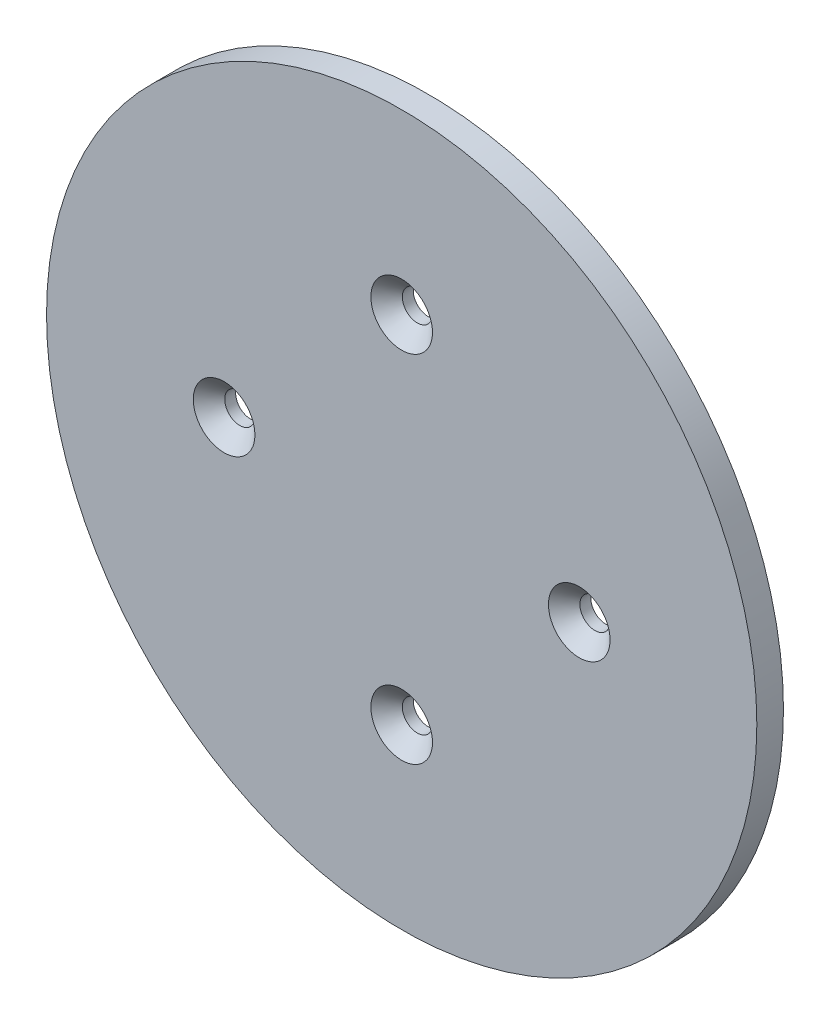
ISO-10303-21;
HEADER;
FILE_DESCRIPTION(('STEP AP214'),'2;1');
FILE_NAME('part.step','',(''),(''),'','','');
FILE_SCHEMA(('AUTOMOTIVE_DESIGN { 1 0 10303 214 1 1 1 1 }'));
ENDSEC;
DATA;
#1=APPLICATION_CONTEXT('core data for automotive mechanical design processes');
#2=APPLICATION_PROTOCOL_DEFINITION('international standard','automotive_design',2000,#1);
#3=PRODUCT_CONTEXT('',#1,'mechanical');
#4=PRODUCT('Part','Part','',(#3));
#5=PRODUCT_RELATED_PRODUCT_CATEGORY('part','',(#4));
#6=PRODUCT_DEFINITION_FORMATION('','',#4);
#7=PRODUCT_DEFINITION_CONTEXT('part definition',#1,'design');
#8=PRODUCT_DEFINITION('design','',#6,#7);
#9=PRODUCT_DEFINITION_SHAPE('','',#8);
#10=(LENGTH_UNIT() NAMED_UNIT(*) SI_UNIT(.MILLI.,.METRE.));
#11=(NAMED_UNIT(*) PLANE_ANGLE_UNIT() SI_UNIT($,.RADIAN.));
#12=(NAMED_UNIT(*) SI_UNIT($,.STERADIAN.) SOLID_ANGLE_UNIT());
#13=UNCERTAINTY_MEASURE_WITH_UNIT(LENGTH_MEASURE(1.E-05),#10,'distance_accuracy_value','');
#14=(GEOMETRIC_REPRESENTATION_CONTEXT(3) GLOBAL_UNCERTAINTY_ASSIGNED_CONTEXT((#13)) GLOBAL_UNIT_ASSIGNED_CONTEXT((#10,
#11,#12)) REPRESENTATION_CONTEXT('',''));
#15=CARTESIAN_POINT('',(0.,0.,0.));
#16=DIRECTION('',(0.,0.,1.));
#17=DIRECTION('',(1.,0.,0.));
#18=AXIS2_PLACEMENT_3D('',#15,#16,#17);
#19=CARTESIAN_POINT('',(0.,0.,3.));
#20=DIRECTION('',(0.,0.,-1.));
#21=DIRECTION('',(-1.,0.,0.));
#22=AXIS2_PLACEMENT_3D('',#19,#20,#21);
#23=CYLINDRICAL_SURFACE('',#22,40.);
#24=CARTESIAN_POINT('',(0.,0.,3.));
#25=DIRECTION('',(0.,0.,1.));
#26=DIRECTION('',(1.,0.,0.));
#27=AXIS2_PLACEMENT_3D('',#24,#25,#26);
#28=CIRCLE('',#27,40.);
#29=CARTESIAN_POINT('',(40.,0.,3.));
#30=VERTEX_POINT('',#29);
#31=EDGE_CURVE('E10',#30,#30,#28,.T.);
#32=ORIENTED_EDGE('',*,*,#31,.F.);
#33=EDGE_LOOP('',(#32));
#34=FACE_BOUND('',#33,.T.);
#35=CARTESIAN_POINT('',(0.,0.,0.));
#36=DIRECTION('',(0.,0.,1.));
#37=DIRECTION('',(1.,0.,0.));
#38=AXIS2_PLACEMENT_3D('',#35,#36,#37);
#39=CIRCLE('',#38,40.);
#40=CARTESIAN_POINT('',(40.,0.,0.));
#41=VERTEX_POINT('',#40);
#42=EDGE_CURVE('E38',#41,#41,#39,.T.);
#43=ORIENTED_EDGE('',*,*,#42,.T.);
#44=EDGE_LOOP('',(#43));
#45=FACE_BOUND('',#44,.T.);
#46=ADVANCED_FACE('F31',(#34,#45),#23,.T.);
#47=CARTESIAN_POINT('',(0.,0.,3.));
#48=DIRECTION('',(0.,0.,1.));
#49=DIRECTION('',(1.,0.,0.));
#50=AXIS2_PLACEMENT_3D('',#47,#48,#49);
#51=PLANE('',#50);
#52=CARTESIAN_POINT('',(0.,20.,3.));
#53=DIRECTION('',(0.,0.,1.));
#54=DIRECTION('',(1.,0.,0.));
#55=AXIS2_PLACEMENT_3D('',#52,#53,#54);
#56=CIRCLE('',#55,3.47);
#57=CARTESIAN_POINT('',(3.47,20.,3.));
#58=VERTEX_POINT('',#57);
#59=EDGE_CURVE('E120',#58,#58,#56,.T.);
#60=ORIENTED_EDGE('',*,*,#59,.F.);
#61=EDGE_LOOP('',(#60));
#62=FACE_BOUND('',#61,.T.);
#63=CARTESIAN_POINT('',(20.,0.,3.));
#64=DIRECTION('',(0.,0.,1.));
#65=DIRECTION('',(1.,0.,0.));
#66=AXIS2_PLACEMENT_3D('',#63,#64,#65);
#67=CIRCLE('',#66,3.47);
#68=CARTESIAN_POINT('',(23.47,0.,3.));
#69=VERTEX_POINT('',#68);
#70=EDGE_CURVE('E64',#69,#69,#67,.T.);
#71=ORIENTED_EDGE('',*,*,#70,.F.);
#72=EDGE_LOOP('',(#71));
#73=FACE_BOUND('',#72,.T.);
#74=CARTESIAN_POINT('',(0.,-20.,3.));
#75=DIRECTION('',(0.,0.,1.));
#76=DIRECTION('',(1.,0.,0.));
#77=AXIS2_PLACEMENT_3D('',#74,#75,#76);
#78=CIRCLE('',#77,3.47);
#79=CARTESIAN_POINT('',(3.47,-20.,3.));
#80=VERTEX_POINT('',#79);
#81=EDGE_CURVE('E57',#80,#80,#78,.T.);
#82=ORIENTED_EDGE('',*,*,#81,.F.);
#83=EDGE_LOOP('',(#82));
#84=FACE_BOUND('',#83,.T.);
#85=CARTESIAN_POINT('',(-20.,0.,3.));
#86=DIRECTION('',(0.,0.,1.));
#87=DIRECTION('',(1.,0.,0.));
#88=AXIS2_PLACEMENT_3D('',#85,#86,#87);
#89=CIRCLE('',#88,3.47);
#90=CARTESIAN_POINT('',(-16.53,0.,3.));
#91=VERTEX_POINT('',#90);
#92=EDGE_CURVE('E53',#91,#91,#89,.T.);
#93=ORIENTED_EDGE('',*,*,#92,.F.);
#94=EDGE_LOOP('',(#93));
#95=FACE_BOUND('',#94,.T.);
#96=ORIENTED_EDGE('',*,*,#31,.T.);
#97=EDGE_LOOP('',(#96));
#98=FACE_BOUND('',#97,.T.);
#99=ADVANCED_FACE('F96',(#62,#73,#84,#95,#98),#51,.T.);
#100=CARTESIAN_POINT('',(0.,0.,0.));
#101=DIRECTION('',(0.,0.,1.));
#102=DIRECTION('',(1.,0.,0.));
#103=AXIS2_PLACEMENT_3D('',#100,#101,#102);
#104=PLANE('',#103);
#105=CARTESIAN_POINT('',(0.,20.,0.));
#106=DIRECTION('',(0.,0.,1.));
#107=DIRECTION('',(1.,0.,0.));
#108=AXIS2_PLACEMENT_3D('',#105,#106,#107);
#109=CIRCLE('',#108,1.69999999999999);
#110=CARTESIAN_POINT('',(1.69999999999999,20.,0.));
#111=VERTEX_POINT('',#110);
#112=EDGE_CURVE('E34',#111,#111,#109,.T.);
#113=ORIENTED_EDGE('',*,*,#112,.T.);
#114=EDGE_LOOP('',(#113));
#115=FACE_BOUND('',#114,.T.);
#116=CARTESIAN_POINT('',(20.,0.,0.));
#117=DIRECTION('',(0.,0.,1.));
#118=DIRECTION('',(1.,0.,0.));
#119=AXIS2_PLACEMENT_3D('',#116,#117,#118);
#120=CIRCLE('',#119,1.69999999999999);
#121=CARTESIAN_POINT('',(21.7,0.,0.));
#122=VERTEX_POINT('',#121);
#123=EDGE_CURVE('E55',#122,#122,#120,.T.);
#124=ORIENTED_EDGE('',*,*,#123,.T.);
#125=EDGE_LOOP('',(#124));
#126=FACE_BOUND('',#125,.T.);
#127=CARTESIAN_POINT('',(0.,-20.,0.));
#128=DIRECTION('',(0.,0.,1.));
#129=DIRECTION('',(1.,0.,0.));
#130=AXIS2_PLACEMENT_3D('',#127,#128,#129);
#131=CIRCLE('',#130,1.69999999999999);
#132=CARTESIAN_POINT('',(1.69999999999999,-20.,0.));
#133=VERTEX_POINT('',#132);
#134=EDGE_CURVE('E51',#133,#133,#131,.T.);
#135=ORIENTED_EDGE('',*,*,#134,.T.);
#136=EDGE_LOOP('',(#135));
#137=FACE_BOUND('',#136,.T.);
#138=CARTESIAN_POINT('',(-20.,0.,0.));
#139=DIRECTION('',(0.,0.,1.));
#140=DIRECTION('',(1.,0.,0.));
#141=AXIS2_PLACEMENT_3D('',#138,#139,#140);
#142=CIRCLE('',#141,1.69999999999999);
#143=CARTESIAN_POINT('',(-18.3,0.,0.));
#144=VERTEX_POINT('',#143);
#145=EDGE_CURVE('E43',#144,#144,#142,.T.);
#146=ORIENTED_EDGE('',*,*,#145,.T.);
#147=EDGE_LOOP('',(#146));
#148=FACE_BOUND('',#147,.T.);
#149=ORIENTED_EDGE('',*,*,#42,.F.);
#150=EDGE_LOOP('',(#149));
#151=FACE_BOUND('',#150,.T.);
#152=ADVANCED_FACE('F93',(#115,#126,#137,#148,#151),#104,.F.);
#153=CARTESIAN_POINT('',(-20.,0.,3.));
#154=DIRECTION('',(0.,0.,1.));
#155=DIRECTION('',(1.,0.,0.));
#156=AXIS2_PLACEMENT_3D('',#153,#154,#155);
#157=CYLINDRICAL_SURFACE('',#156,1.69999999999999);
#158=CARTESIAN_POINT('',(-20.,0.,1.23));
#159=DIRECTION('',(0.,0.,1.));
#160=DIRECTION('',(1.,0.,0.));
#161=AXIS2_PLACEMENT_3D('',#158,#159,#160);
#162=CIRCLE('',#161,1.7);
#163=CARTESIAN_POINT('',(-18.3,0.,1.23));
#164=VERTEX_POINT('',#163);
#165=EDGE_CURVE('E46',#164,#164,#162,.T.);
#166=ORIENTED_EDGE('',*,*,#165,.T.);
#167=EDGE_LOOP('',(#166));
#168=FACE_BOUND('',#167,.T.);
#169=ORIENTED_EDGE('',*,*,#145,.F.);
#170=EDGE_LOOP('',(#169));
#171=FACE_BOUND('',#170,.T.);
#172=ADVANCED_FACE('F79',(#168,#171),#157,.F.);
#173=CARTESIAN_POINT('',(-20.,0.,3.));
#174=DIRECTION('',(0.,0.,1.));
#175=DIRECTION('',(1.,0.,0.));
#176=AXIS2_PLACEMENT_3D('',#173,#174,#175);
#177=CONICAL_SURFACE('',#176,3.47,0.785398163397447);
#178=ORIENTED_EDGE('',*,*,#165,.F.);
#179=EDGE_LOOP('',(#178));
#180=FACE_BOUND('',#179,.T.);
#181=ORIENTED_EDGE('',*,*,#92,.T.);
#182=EDGE_LOOP('',(#181));
#183=FACE_BOUND('',#182,.T.);
#184=ADVANCED_FACE('F82',(#180,#183),#177,.F.);
#185=CARTESIAN_POINT('',(0.,-20.,3.));
#186=DIRECTION('',(0.,0.,1.));
#187=DIRECTION('',(1.,0.,0.));
#188=AXIS2_PLACEMENT_3D('',#185,#186,#187);
#189=CYLINDRICAL_SURFACE('',#188,1.69999999999999);
#190=CARTESIAN_POINT('',(0.,-20.,1.23));
#191=DIRECTION('',(0.,0.,1.));
#192=DIRECTION('',(1.,0.,0.));
#193=AXIS2_PLACEMENT_3D('',#190,#191,#192);
#194=CIRCLE('',#193,1.7);
#195=CARTESIAN_POINT('',(1.7,-20.,1.23));
#196=VERTEX_POINT('',#195);
#197=EDGE_CURVE('E54',#196,#196,#194,.T.);
#198=ORIENTED_EDGE('',*,*,#197,.T.);
#199=EDGE_LOOP('',(#198));
#200=FACE_BOUND('',#199,.T.);
#201=ORIENTED_EDGE('',*,*,#134,.F.);
#202=EDGE_LOOP('',(#201));
#203=FACE_BOUND('',#202,.T.);
#204=ADVANCED_FACE('F84',(#200,#203),#189,.F.);
#205=CARTESIAN_POINT('',(0.,-20.,3.));
#206=DIRECTION('',(0.,0.,1.));
#207=DIRECTION('',(1.,0.,0.));
#208=AXIS2_PLACEMENT_3D('',#205,#206,#207);
#209=CONICAL_SURFACE('',#208,3.47,0.785398163397448);
#210=ORIENTED_EDGE('',*,*,#197,.F.);
#211=EDGE_LOOP('',(#210));
#212=FACE_BOUND('',#211,.T.);
#213=ORIENTED_EDGE('',*,*,#81,.T.);
#214=EDGE_LOOP('',(#213));
#215=FACE_BOUND('',#214,.T.);
#216=ADVANCED_FACE('F90',(#212,#215),#209,.F.);
#217=CARTESIAN_POINT('',(20.,0.,3.));
#218=DIRECTION('',(0.,0.,1.));
#219=DIRECTION('',(1.,0.,0.));
#220=AXIS2_PLACEMENT_3D('',#217,#218,#219);
#221=CYLINDRICAL_SURFACE('',#220,1.69999999999999);
#222=CARTESIAN_POINT('',(20.,0.,1.23));
#223=DIRECTION('',(0.,0.,1.));
#224=DIRECTION('',(1.,0.,0.));
#225=AXIS2_PLACEMENT_3D('',#222,#223,#224);
#226=CIRCLE('',#225,1.7);
#227=CARTESIAN_POINT('',(21.7,0.,1.23));
#228=VERTEX_POINT('',#227);
#229=EDGE_CURVE('E58',#228,#228,#226,.T.);
#230=ORIENTED_EDGE('',*,*,#229,.T.);
#231=EDGE_LOOP('',(#230));
#232=FACE_BOUND('',#231,.T.);
#233=ORIENTED_EDGE('',*,*,#123,.F.);
#234=EDGE_LOOP('',(#233));
#235=FACE_BOUND('',#234,.T.);
#236=ADVANCED_FACE('F135',(#232,#235),#221,.F.);
#237=CARTESIAN_POINT('',(20.,0.,3.));
#238=DIRECTION('',(0.,0.,1.));
#239=DIRECTION('',(1.,0.,0.));
#240=AXIS2_PLACEMENT_3D('',#237,#238,#239);
#241=CONICAL_SURFACE('',#240,3.47,0.785398163397447);
#242=ORIENTED_EDGE('',*,*,#229,.F.);
#243=EDGE_LOOP('',(#242));
#244=FACE_BOUND('',#243,.T.);
#245=ORIENTED_EDGE('',*,*,#70,.T.);
#246=EDGE_LOOP('',(#245));
#247=FACE_BOUND('',#246,.T.);
#248=ADVANCED_FACE('F141',(#244,#247),#241,.F.);
#249=CARTESIAN_POINT('',(0.,20.,3.));
#250=DIRECTION('',(0.,0.,1.));
#251=DIRECTION('',(1.,0.,0.));
#252=AXIS2_PLACEMENT_3D('',#249,#250,#251);
#253=CYLINDRICAL_SURFACE('',#252,1.69999999999999);
#254=CARTESIAN_POINT('',(0.,20.,1.23));
#255=DIRECTION('',(0.,0.,1.));
#256=DIRECTION('',(1.,0.,0.));
#257=AXIS2_PLACEMENT_3D('',#254,#255,#256);
#258=CIRCLE('',#257,1.7);
#259=CARTESIAN_POINT('',(1.7,20.,1.23));
#260=VERTEX_POINT('',#259);
#261=EDGE_CURVE('E118',#260,#260,#258,.T.);
#262=ORIENTED_EDGE('',*,*,#261,.T.);
#263=EDGE_LOOP('',(#262));
#264=FACE_BOUND('',#263,.T.);
#265=ORIENTED_EDGE('',*,*,#112,.F.);
#266=EDGE_LOOP('',(#265));
#267=FACE_BOUND('',#266,.T.);
#268=ADVANCED_FACE('F147',(#264,#267),#253,.F.);
#269=CARTESIAN_POINT('',(0.,20.,3.));
#270=DIRECTION('',(0.,0.,1.));
#271=DIRECTION('',(1.,0.,0.));
#272=AXIS2_PLACEMENT_3D('',#269,#270,#271);
#273=CONICAL_SURFACE('',#272,3.47,0.785398163397448);
#274=ORIENTED_EDGE('',*,*,#261,.F.);
#275=EDGE_LOOP('',(#274));
#276=FACE_BOUND('',#275,.T.);
#277=ORIENTED_EDGE('',*,*,#59,.T.);
#278=EDGE_LOOP('',(#277));
#279=FACE_BOUND('',#278,.T.);
#280=ADVANCED_FACE('F127',(#276,#279),#273,.F.);
#281=CLOSED_SHELL('',(#46,#99,#152,#172,#184,#204,#216,#236,#248,#268,#280));
#282=MANIFOLD_SOLID_BREP('B2',#281);
#283=ADVANCED_BREP_SHAPE_REPRESENTATION('',(#18,#282),#14);
#284=SHAPE_DEFINITION_REPRESENTATION(#9,#283);
ENDSEC;
END-ISO-10303-21;
